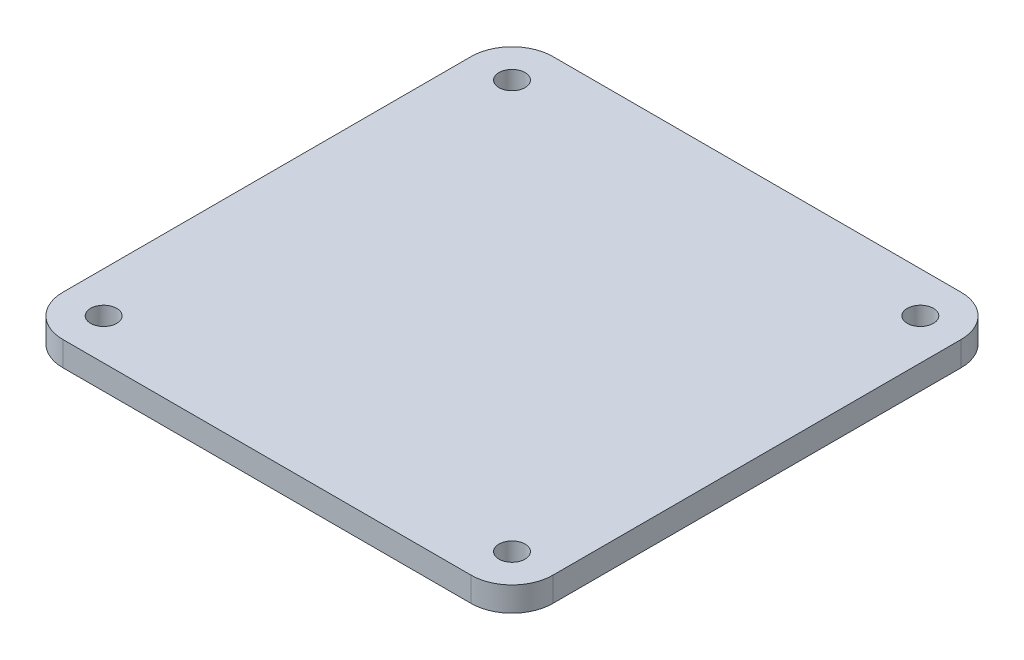
ISO-10303-21;
HEADER;
FILE_DESCRIPTION(('STEP AP214'),'2;1');
FILE_NAME('part.step','',(''),(''),'','','');
FILE_SCHEMA(('AUTOMOTIVE_DESIGN { 1 0 10303 214 1 1 1 1 }'));
ENDSEC;
DATA;
#1=APPLICATION_CONTEXT('core data for automotive mechanical design processes');
#2=APPLICATION_PROTOCOL_DEFINITION('international standard','automotive_design',2000,#1);
#3=PRODUCT_CONTEXT('',#1,'mechanical');
#4=PRODUCT('Part','Part','',(#3));
#5=PRODUCT_RELATED_PRODUCT_CATEGORY('part','',(#4));
#6=PRODUCT_DEFINITION_FORMATION('','',#4);
#7=PRODUCT_DEFINITION_CONTEXT('part definition',#1,'design');
#8=PRODUCT_DEFINITION('design','',#6,#7);
#9=PRODUCT_DEFINITION_SHAPE('','',#8);
#10=(LENGTH_UNIT() NAMED_UNIT(*) SI_UNIT(.MILLI.,.METRE.));
#11=(NAMED_UNIT(*) PLANE_ANGLE_UNIT() SI_UNIT($,.RADIAN.));
#12=(NAMED_UNIT(*) SI_UNIT($,.STERADIAN.) SOLID_ANGLE_UNIT());
#13=UNCERTAINTY_MEASURE_WITH_UNIT(LENGTH_MEASURE(1.E-05),#10,'distance_accuracy_value','');
#14=(GEOMETRIC_REPRESENTATION_CONTEXT(3) GLOBAL_UNCERTAINTY_ASSIGNED_CONTEXT((#13)) GLOBAL_UNIT_ASSIGNED_CONTEXT((#10,
#11,#12)) REPRESENTATION_CONTEXT('',''));
#15=CARTESIAN_POINT('',(0.,0.,0.));
#16=DIRECTION('',(0.,0.,1.));
#17=DIRECTION('',(1.,0.,0.));
#18=AXIS2_PLACEMENT_3D('',#15,#16,#17);
#19=CARTESIAN_POINT('',(-25.,7.25750000000012,-25.));
#20=DIRECTION('',(0.,1.,0.));
#21=DIRECTION('',(0.,0.,1.));
#22=AXIS2_PLACEMENT_3D('',#19,#20,#21);
#23=PLANE('',#22);
#24=CARTESIAN_POINT('',(-25.,7.25749999999977,25.));
#25=DIRECTION('',(0.,1.,0.));
#26=DIRECTION('',(0.,0.,1.));
#27=AXIS2_PLACEMENT_3D('',#24,#25,#26);
#28=CIRCLE('',#27,1.59999999999999);
#29=CARTESIAN_POINT('',(-25.,7.25749999999976,26.6));
#30=VERTEX_POINT('',#29);
#31=EDGE_CURVE('E214',#30,#30,#28,.T.);
#32=ORIENTED_EDGE('',*,*,#31,.F.);
#33=EDGE_LOOP('',(#32));
#34=FACE_BOUND('',#33,.T.);
#35=CARTESIAN_POINT('',(25.,7.25750000000012,-25.));
#36=DIRECTION('',(0.,1.,0.));
#37=DIRECTION('',(0.,0.,1.));
#38=AXIS2_PLACEMENT_3D('',#35,#36,#37);
#39=CIRCLE('',#38,1.59999999999999);
#40=CARTESIAN_POINT('',(25.,7.25750000000011,-23.4));
#41=VERTEX_POINT('',#40);
#42=EDGE_CURVE('E152',#41,#41,#39,.T.);
#43=ORIENTED_EDGE('',*,*,#42,.F.);
#44=EDGE_LOOP('',(#43));
#45=FACE_BOUND('',#44,.T.);
#46=CARTESIAN_POINT('',(-25.,7.25750000000012,-25.));
#47=DIRECTION('',(0.,1.,0.));
#48=DIRECTION('',(0.,0.,1.));
#49=AXIS2_PLACEMENT_3D('',#46,#47,#48);
#50=CIRCLE('',#49,5.);
#51=CARTESIAN_POINT('',(-25.,7.25750000000016,-30.));
#52=VERTEX_POINT('',#51);
#53=CARTESIAN_POINT('',(-30.,7.25750000000012,-25.));
#54=VERTEX_POINT('',#53);
#55=EDGE_CURVE('E167',#52,#54,#50,.T.);
#56=ORIENTED_EDGE('',*,*,#55,.T.);
#57=DIRECTION('',(0.,0.,1.));
#58=VECTOR('',#57,1.);
#59=CARTESIAN_POINT('',(-30.,7.25750000000012,-25.));
#60=LINE('',#59,#58);
#61=CARTESIAN_POINT('',(-30.,7.25749999999977,25.));
#62=VERTEX_POINT('',#61);
#63=EDGE_CURVE('E109',#54,#62,#60,.T.);
#64=ORIENTED_EDGE('',*,*,#63,.T.);
#65=CARTESIAN_POINT('',(-25.,7.25749999999977,25.));
#66=DIRECTION('',(0.,1.,0.));
#67=DIRECTION('',(0.,0.,1.));
#68=AXIS2_PLACEMENT_3D('',#65,#66,#67);
#69=CIRCLE('',#68,5.);
#70=CARTESIAN_POINT('',(-25.,7.25749999999974,30.));
#71=VERTEX_POINT('',#70);
#72=EDGE_CURVE('E184',#62,#71,#69,.T.);
#73=ORIENTED_EDGE('',*,*,#72,.T.);
#74=DIRECTION('',(1.,0.,0.));
#75=VECTOR('',#74,1.);
#76=CARTESIAN_POINT('',(-25.,7.25749999999974,30.));
#77=LINE('',#76,#75);
#78=CARTESIAN_POINT('',(25.,7.25749999999974,30.));
#79=VERTEX_POINT('',#78);
#80=EDGE_CURVE('E197',#71,#79,#77,.T.);
#81=ORIENTED_EDGE('',*,*,#80,.T.);
#82=CARTESIAN_POINT('',(25.,7.25749999999977,25.));
#83=DIRECTION('',(0.,1.,0.));
#84=DIRECTION('',(0.,0.,1.));
#85=AXIS2_PLACEMENT_3D('',#82,#83,#84);
#86=CIRCLE('',#85,5.);
#87=CARTESIAN_POINT('',(30.,7.25749999999977,25.));
#88=VERTEX_POINT('',#87);
#89=EDGE_CURVE('E129',#79,#88,#86,.T.);
#90=ORIENTED_EDGE('',*,*,#89,.T.);
#91=DIRECTION('',(0.,0.,-1.));
#92=VECTOR('',#91,1.);
#93=CARTESIAN_POINT('',(30.,7.25749999999977,25.));
#94=LINE('',#93,#92);
#95=CARTESIAN_POINT('',(30.,7.25750000000012,-25.));
#96=VERTEX_POINT('',#95);
#97=EDGE_CURVE('E123',#88,#96,#94,.T.);
#98=ORIENTED_EDGE('',*,*,#97,.T.);
#99=CARTESIAN_POINT('',(25.,7.25750000000012,-25.));
#100=DIRECTION('',(0.,1.,0.));
#101=DIRECTION('',(0.,0.,1.));
#102=AXIS2_PLACEMENT_3D('',#99,#100,#101);
#103=CIRCLE('',#102,5.);
#104=CARTESIAN_POINT('',(25.,7.25750000000015,-30.));
#105=VERTEX_POINT('',#104);
#106=EDGE_CURVE('E127',#96,#105,#103,.T.);
#107=ORIENTED_EDGE('',*,*,#106,.T.);
#108=DIRECTION('',(-1.,0.,0.));
#109=VECTOR('',#108,1.);
#110=CARTESIAN_POINT('',(25.,7.25750000000016,-30.));
#111=LINE('',#110,#109);
#112=EDGE_CURVE('E64',#105,#52,#111,.T.);
#113=ORIENTED_EDGE('',*,*,#112,.T.);
#114=EDGE_LOOP('',(#56,#64,#73,#81,#90,#98,#107,#113));
#115=FACE_BOUND('',#114,.T.);
#116=CARTESIAN_POINT('',(-25.,7.25750000000012,-25.));
#117=DIRECTION('',(0.,1.,0.));
#118=DIRECTION('',(0.,0.,1.));
#119=AXIS2_PLACEMENT_3D('',#116,#117,#118);
#120=CIRCLE('',#119,1.59999999999999);
#121=CARTESIAN_POINT('',(-25.,7.25750000000011,-23.4));
#122=VERTEX_POINT('',#121);
#123=EDGE_CURVE('E208',#122,#122,#120,.T.);
#124=ORIENTED_EDGE('',*,*,#123,.F.);
#125=EDGE_LOOP('',(#124));
#126=FACE_BOUND('',#125,.T.);
#127=CARTESIAN_POINT('',(25.,7.25749999999977,25.));
#128=DIRECTION('',(0.,1.,0.));
#129=DIRECTION('',(0.,0.,1.));
#130=AXIS2_PLACEMENT_3D('',#127,#128,#129);
#131=CIRCLE('',#130,1.59999999999999);
#132=CARTESIAN_POINT('',(25.,7.25749999999976,26.6));
#133=VERTEX_POINT('',#132);
#134=EDGE_CURVE('E220',#133,#133,#131,.T.);
#135=ORIENTED_EDGE('',*,*,#134,.F.);
#136=EDGE_LOOP('',(#135));
#137=FACE_BOUND('',#136,.T.);
#138=ADVANCED_FACE('F47',(#34,#45,#115,#126,#137),#23,.T.);
#139=CARTESIAN_POINT('',(-25.,4.25750000000012,-25.));
#140=DIRECTION('',(0.,1.,0.));
#141=DIRECTION('',(0.,0.,1.));
#142=AXIS2_PLACEMENT_3D('',#139,#140,#141);
#143=PLANE('',#142);
#144=CARTESIAN_POINT('',(-25.,4.25750000000012,-25.));
#145=DIRECTION('',(0.,1.,0.));
#146=DIRECTION('',(0.,0.,1.));
#147=AXIS2_PLACEMENT_3D('',#144,#145,#146);
#148=CIRCLE('',#147,5.);
#149=CARTESIAN_POINT('',(-25.,4.25750000000015,-30.));
#150=VERTEX_POINT('',#149);
#151=CARTESIAN_POINT('',(-30.,4.25750000000012,-25.));
#152=VERTEX_POINT('',#151);
#153=EDGE_CURVE('E148',#150,#152,#148,.T.);
#154=ORIENTED_EDGE('',*,*,#153,.F.);
#155=DIRECTION('',(-1.,0.,0.));
#156=VECTOR('',#155,1.);
#157=CARTESIAN_POINT('',(25.,4.25750000000015,-30.));
#158=LINE('',#157,#156);
#159=CARTESIAN_POINT('',(25.,4.25750000000015,-30.));
#160=VERTEX_POINT('',#159);
#161=EDGE_CURVE('E101',#160,#150,#158,.T.);
#162=ORIENTED_EDGE('',*,*,#161,.F.);
#163=CARTESIAN_POINT('',(25.,4.25750000000012,-25.));
#164=DIRECTION('',(0.,1.,0.));
#165=DIRECTION('',(0.,0.,1.));
#166=AXIS2_PLACEMENT_3D('',#163,#164,#165);
#167=CIRCLE('',#166,5.);
#168=CARTESIAN_POINT('',(30.,4.25750000000012,-25.));
#169=VERTEX_POINT('',#168);
#170=EDGE_CURVE('E95',#169,#160,#167,.T.);
#171=ORIENTED_EDGE('',*,*,#170,.F.);
#172=DIRECTION('',(0.,0.,-1.));
#173=VECTOR('',#172,1.);
#174=CARTESIAN_POINT('',(30.,4.25749999999977,25.));
#175=LINE('',#174,#173);
#176=CARTESIAN_POINT('',(30.,4.25749999999977,25.));
#177=VERTEX_POINT('',#176);
#178=EDGE_CURVE('E138',#177,#169,#175,.T.);
#179=ORIENTED_EDGE('',*,*,#178,.F.);
#180=CARTESIAN_POINT('',(25.,4.25749999999977,25.));
#181=DIRECTION('',(0.,1.,0.));
#182=DIRECTION('',(0.,0.,1.));
#183=AXIS2_PLACEMENT_3D('',#180,#181,#182);
#184=CIRCLE('',#183,5.);
#185=CARTESIAN_POINT('',(25.,4.25749999999974,30.));
#186=VERTEX_POINT('',#185);
#187=EDGE_CURVE('E160',#186,#177,#184,.T.);
#188=ORIENTED_EDGE('',*,*,#187,.F.);
#189=DIRECTION('',(1.,0.,0.));
#190=VECTOR('',#189,1.);
#191=CARTESIAN_POINT('',(-25.,4.25749999999974,30.));
#192=LINE('',#191,#190);
#193=CARTESIAN_POINT('',(-25.,4.25749999999974,30.));
#194=VERTEX_POINT('',#193);
#195=EDGE_CURVE('E157',#194,#186,#192,.T.);
#196=ORIENTED_EDGE('',*,*,#195,.F.);
#197=CARTESIAN_POINT('',(-25.,4.25749999999977,25.));
#198=DIRECTION('',(0.,1.,0.));
#199=DIRECTION('',(0.,0.,1.));
#200=AXIS2_PLACEMENT_3D('',#197,#198,#199);
#201=CIRCLE('',#200,5.);
#202=CARTESIAN_POINT('',(-30.,4.25749999999977,25.));
#203=VERTEX_POINT('',#202);
#204=EDGE_CURVE('E154',#203,#194,#201,.T.);
#205=ORIENTED_EDGE('',*,*,#204,.F.);
#206=DIRECTION('',(0.,0.,1.));
#207=VECTOR('',#206,1.);
#208=CARTESIAN_POINT('',(-30.,4.25750000000012,-25.));
#209=LINE('',#208,#207);
#210=EDGE_CURVE('E151',#152,#203,#209,.T.);
#211=ORIENTED_EDGE('',*,*,#210,.F.);
#212=EDGE_LOOP('',(#154,#162,#171,#179,#188,#196,#205,#211));
#213=FACE_BOUND('',#212,.T.);
#214=CARTESIAN_POINT('',(25.,4.25750000000012,-25.));
#215=DIRECTION('',(0.,1.,0.));
#216=DIRECTION('',(0.,0.,1.));
#217=AXIS2_PLACEMENT_3D('',#214,#215,#216);
#218=CIRCLE('',#217,1.59999999999999);
#219=CARTESIAN_POINT('',(25.,4.25750000000011,-23.4));
#220=VERTEX_POINT('',#219);
#221=EDGE_CURVE('E205',#220,#220,#218,.T.);
#222=ORIENTED_EDGE('',*,*,#221,.T.);
#223=EDGE_LOOP('',(#222));
#224=FACE_BOUND('',#223,.T.);
#225=CARTESIAN_POINT('',(-25.,4.25750000000012,-25.));
#226=DIRECTION('',(0.,1.,0.));
#227=DIRECTION('',(0.,0.,1.));
#228=AXIS2_PLACEMENT_3D('',#225,#226,#227);
#229=CIRCLE('',#228,1.59999999999999);
#230=CARTESIAN_POINT('',(-25.,4.25750000000011,-23.4));
#231=VERTEX_POINT('',#230);
#232=EDGE_CURVE('E211',#231,#231,#229,.T.);
#233=ORIENTED_EDGE('',*,*,#232,.T.);
#234=EDGE_LOOP('',(#233));
#235=FACE_BOUND('',#234,.T.);
#236=CARTESIAN_POINT('',(-25.,4.25749999999977,25.));
#237=DIRECTION('',(0.,1.,0.));
#238=DIRECTION('',(0.,0.,1.));
#239=AXIS2_PLACEMENT_3D('',#236,#237,#238);
#240=CIRCLE('',#239,1.59999999999999);
#241=CARTESIAN_POINT('',(-25.,4.25749999999976,26.6));
#242=VERTEX_POINT('',#241);
#243=EDGE_CURVE('E217',#242,#242,#240,.T.);
#244=ORIENTED_EDGE('',*,*,#243,.T.);
#245=EDGE_LOOP('',(#244));
#246=FACE_BOUND('',#245,.T.);
#247=CARTESIAN_POINT('',(25.,4.25749999999977,25.));
#248=DIRECTION('',(0.,1.,0.));
#249=DIRECTION('',(0.,0.,1.));
#250=AXIS2_PLACEMENT_3D('',#247,#248,#249);
#251=CIRCLE('',#250,1.59999999999999);
#252=CARTESIAN_POINT('',(25.,4.25749999999976,26.6));
#253=VERTEX_POINT('',#252);
#254=EDGE_CURVE('E223',#253,#253,#251,.T.);
#255=ORIENTED_EDGE('',*,*,#254,.T.);
#256=EDGE_LOOP('',(#255));
#257=FACE_BOUND('',#256,.T.);
#258=ADVANCED_FACE('F188',(#213,#224,#235,#246,#257),#143,.F.);
#259=CARTESIAN_POINT('',(-25.,7.25750000000012,-25.));
#260=DIRECTION('',(0.,-1.,0.));
#261=DIRECTION('',(0.,0.,-1.));
#262=AXIS2_PLACEMENT_3D('',#259,#260,#261);
#263=CYLINDRICAL_SURFACE('',#262,5.);
#264=ORIENTED_EDGE('',*,*,#153,.T.);
#265=DIRECTION('',(0.,-1.,0.));
#266=VECTOR('',#265,1.);
#267=CARTESIAN_POINT('',(-30.,7.25750000000012,-25.));
#268=LINE('',#267,#266);
#269=EDGE_CURVE('E11',#54,#152,#268,.T.);
#270=ORIENTED_EDGE('',*,*,#269,.F.);
#271=ORIENTED_EDGE('',*,*,#55,.F.);
#272=DIRECTION('',(0.,-1.,0.));
#273=VECTOR('',#272,1.);
#274=CARTESIAN_POINT('',(-25.,7.25750000000016,-30.));
#275=LINE('',#274,#273);
#276=EDGE_CURVE('E144',#52,#150,#275,.T.);
#277=ORIENTED_EDGE('',*,*,#276,.T.);
#278=EDGE_LOOP('',(#264,#270,#271,#277));
#279=FACE_BOUND('',#278,.T.);
#280=ADVANCED_FACE('F49',(#279),#263,.T.);
#281=CARTESIAN_POINT('',(-30.,7.25750000000012,-25.));
#282=DIRECTION('',(1.,0.,0.));
#283=DIRECTION('',(0.,0.,-1.));
#284=AXIS2_PLACEMENT_3D('',#281,#282,#283);
#285=PLANE('',#284);
#286=ORIENTED_EDGE('',*,*,#210,.T.);
#287=DIRECTION('',(0.,-1.,0.));
#288=VECTOR('',#287,1.);
#289=CARTESIAN_POINT('',(-30.,7.25749999999977,25.));
#290=LINE('',#289,#288);
#291=EDGE_CURVE('E56',#62,#203,#290,.T.);
#292=ORIENTED_EDGE('',*,*,#291,.F.);
#293=ORIENTED_EDGE('',*,*,#63,.F.);
#294=ORIENTED_EDGE('',*,*,#269,.T.);
#295=EDGE_LOOP('',(#286,#292,#293,#294));
#296=FACE_BOUND('',#295,.T.);
#297=ADVANCED_FACE('F258',(#296),#285,.F.);
#298=CARTESIAN_POINT('',(-25.,7.25749999999977,25.));
#299=DIRECTION('',(0.,-1.,0.));
#300=DIRECTION('',(0.,0.,-1.));
#301=AXIS2_PLACEMENT_3D('',#298,#299,#300);
#302=CYLINDRICAL_SURFACE('',#301,5.);
#303=ORIENTED_EDGE('',*,*,#204,.T.);
#304=DIRECTION('',(0.,-1.,0.));
#305=VECTOR('',#304,1.);
#306=CARTESIAN_POINT('',(-25.,7.25749999999974,30.));
#307=LINE('',#306,#305);
#308=EDGE_CURVE('E175',#71,#194,#307,.T.);
#309=ORIENTED_EDGE('',*,*,#308,.F.);
#310=ORIENTED_EDGE('',*,*,#72,.F.);
#311=ORIENTED_EDGE('',*,*,#291,.T.);
#312=EDGE_LOOP('',(#303,#309,#310,#311));
#313=FACE_BOUND('',#312,.T.);
#314=ADVANCED_FACE('F182',(#313),#302,.T.);
#315=CARTESIAN_POINT('',(-25.,7.25749999999974,30.));
#316=DIRECTION('',(0.,0.,-1.));
#317=DIRECTION('',(0.,1.,0.));
#318=AXIS2_PLACEMENT_3D('',#315,#316,#317);
#319=PLANE('',#318);
#320=ORIENTED_EDGE('',*,*,#195,.T.);
#321=DIRECTION('',(0.,-1.,0.));
#322=VECTOR('',#321,1.);
#323=CARTESIAN_POINT('',(25.,7.25749999999974,30.));
#324=LINE('',#323,#322);
#325=EDGE_CURVE('E171',#79,#186,#324,.T.);
#326=ORIENTED_EDGE('',*,*,#325,.F.);
#327=ORIENTED_EDGE('',*,*,#80,.F.);
#328=ORIENTED_EDGE('',*,*,#308,.T.);
#329=EDGE_LOOP('',(#320,#326,#327,#328));
#330=FACE_BOUND('',#329,.T.);
#331=ADVANCED_FACE('F193',(#330),#319,.F.);
#332=CARTESIAN_POINT('',(25.,7.25749999999977,25.));
#333=DIRECTION('',(0.,-1.,0.));
#334=DIRECTION('',(0.,0.,-1.));
#335=AXIS2_PLACEMENT_3D('',#332,#333,#334);
#336=CYLINDRICAL_SURFACE('',#335,5.);
#337=ORIENTED_EDGE('',*,*,#187,.T.);
#338=DIRECTION('',(0.,-1.,0.));
#339=VECTOR('',#338,1.);
#340=CARTESIAN_POINT('',(30.,7.25749999999977,25.));
#341=LINE('',#340,#339);
#342=EDGE_CURVE('E139',#88,#177,#341,.T.);
#343=ORIENTED_EDGE('',*,*,#342,.F.);
#344=ORIENTED_EDGE('',*,*,#89,.F.);
#345=ORIENTED_EDGE('',*,*,#325,.T.);
#346=EDGE_LOOP('',(#337,#343,#344,#345));
#347=FACE_BOUND('',#346,.T.);
#348=ADVANCED_FACE('F196',(#347),#336,.T.);
#349=CARTESIAN_POINT('',(30.,7.25749999999977,25.));
#350=DIRECTION('',(-1.,0.,0.));
#351=DIRECTION('',(0.,0.,1.));
#352=AXIS2_PLACEMENT_3D('',#349,#350,#351);
#353=PLANE('',#352);
#354=ORIENTED_EDGE('',*,*,#178,.T.);
#355=DIRECTION('',(0.,-1.,0.));
#356=VECTOR('',#355,1.);
#357=CARTESIAN_POINT('',(30.,7.25750000000012,-25.));
#358=LINE('',#357,#356);
#359=EDGE_CURVE('E135',#96,#169,#358,.T.);
#360=ORIENTED_EDGE('',*,*,#359,.F.);
#361=ORIENTED_EDGE('',*,*,#97,.F.);
#362=ORIENTED_EDGE('',*,*,#342,.T.);
#363=EDGE_LOOP('',(#354,#360,#361,#362));
#364=FACE_BOUND('',#363,.T.);
#365=ADVANCED_FACE('F136',(#364),#353,.F.);
#366=CARTESIAN_POINT('',(25.,7.25750000000012,-25.));
#367=DIRECTION('',(0.,-1.,0.));
#368=DIRECTION('',(0.,0.,-1.));
#369=AXIS2_PLACEMENT_3D('',#366,#367,#368);
#370=CYLINDRICAL_SURFACE('',#369,5.);
#371=ORIENTED_EDGE('',*,*,#170,.T.);
#372=DIRECTION('',(0.,-1.,0.));
#373=VECTOR('',#372,1.);
#374=CARTESIAN_POINT('',(25.,7.25750000000015,-30.));
#375=LINE('',#374,#373);
#376=EDGE_CURVE('E140',#105,#160,#375,.T.);
#377=ORIENTED_EDGE('',*,*,#376,.F.);
#378=ORIENTED_EDGE('',*,*,#106,.F.);
#379=ORIENTED_EDGE('',*,*,#359,.T.);
#380=EDGE_LOOP('',(#371,#377,#378,#379));
#381=FACE_BOUND('',#380,.T.);
#382=ADVANCED_FACE('F142',(#381),#370,.T.);
#383=CARTESIAN_POINT('',(25.,7.25750000000016,-30.));
#384=DIRECTION('',(0.,0.,1.));
#385=DIRECTION('',(0.,-1.,0.));
#386=AXIS2_PLACEMENT_3D('',#383,#384,#385);
#387=PLANE('',#386);
#388=ORIENTED_EDGE('',*,*,#161,.T.);
#389=ORIENTED_EDGE('',*,*,#276,.F.);
#390=ORIENTED_EDGE('',*,*,#112,.F.);
#391=ORIENTED_EDGE('',*,*,#376,.T.);
#392=EDGE_LOOP('',(#388,#389,#390,#391));
#393=FACE_BOUND('',#392,.T.);
#394=ADVANCED_FACE('F247',(#393),#387,.F.);
#395=CARTESIAN_POINT('',(25.,7.25750000000012,-25.));
#396=DIRECTION('',(0.,-1.,0.));
#397=DIRECTION('',(0.,0.,-1.));
#398=AXIS2_PLACEMENT_3D('',#395,#396,#397);
#399=CYLINDRICAL_SURFACE('',#398,1.59999999999999);
#400=ORIENTED_EDGE('',*,*,#42,.T.);
#401=EDGE_LOOP('',(#400));
#402=FACE_BOUND('',#401,.T.);
#403=ORIENTED_EDGE('',*,*,#221,.F.);
#404=EDGE_LOOP('',(#403));
#405=FACE_BOUND('',#404,.T.);
#406=ADVANCED_FACE('F244',(#402,#405),#399,.F.);
#407=CARTESIAN_POINT('',(-25.,7.25750000000012,-25.));
#408=DIRECTION('',(0.,-1.,0.));
#409=DIRECTION('',(0.,0.,-1.));
#410=AXIS2_PLACEMENT_3D('',#407,#408,#409);
#411=CYLINDRICAL_SURFACE('',#410,1.59999999999999);
#412=ORIENTED_EDGE('',*,*,#123,.T.);
#413=EDGE_LOOP('',(#412));
#414=FACE_BOUND('',#413,.T.);
#415=ORIENTED_EDGE('',*,*,#232,.F.);
#416=EDGE_LOOP('',(#415));
#417=FACE_BOUND('',#416,.T.);
#418=ADVANCED_FACE('F326',(#414,#417),#411,.F.);
#419=CARTESIAN_POINT('',(-25.,7.25749999999977,25.));
#420=DIRECTION('',(0.,-1.,0.));
#421=DIRECTION('',(0.,0.,-1.));
#422=AXIS2_PLACEMENT_3D('',#419,#420,#421);
#423=CYLINDRICAL_SURFACE('',#422,1.59999999999999);
#424=ORIENTED_EDGE('',*,*,#31,.T.);
#425=EDGE_LOOP('',(#424));
#426=FACE_BOUND('',#425,.T.);
#427=ORIENTED_EDGE('',*,*,#243,.F.);
#428=EDGE_LOOP('',(#427));
#429=FACE_BOUND('',#428,.T.);
#430=ADVANCED_FACE('F334',(#426,#429),#423,.F.);
#431=CARTESIAN_POINT('',(25.,7.25749999999977,25.));
#432=DIRECTION('',(0.,-1.,0.));
#433=DIRECTION('',(0.,0.,-1.));
#434=AXIS2_PLACEMENT_3D('',#431,#432,#433);
#435=CYLINDRICAL_SURFACE('',#434,1.59999999999999);
#436=ORIENTED_EDGE('',*,*,#134,.T.);
#437=EDGE_LOOP('',(#436));
#438=FACE_BOUND('',#437,.T.);
#439=ORIENTED_EDGE('',*,*,#254,.F.);
#440=EDGE_LOOP('',(#439));
#441=FACE_BOUND('',#440,.T.);
#442=ADVANCED_FACE('F231',(#438,#441),#435,.F.);
#443=CLOSED_SHELL('',(#138,#258,#280,#297,#314,#331,#348,#365,#382,#394,#406,#418,#430,#442));
#444=MANIFOLD_SOLID_BREP('B2',#443);
#445=ADVANCED_BREP_SHAPE_REPRESENTATION('',(#18,#444),#14);
#446=SHAPE_DEFINITION_REPRESENTATION(#9,#445);
ENDSEC;
END-ISO-10303-21;
